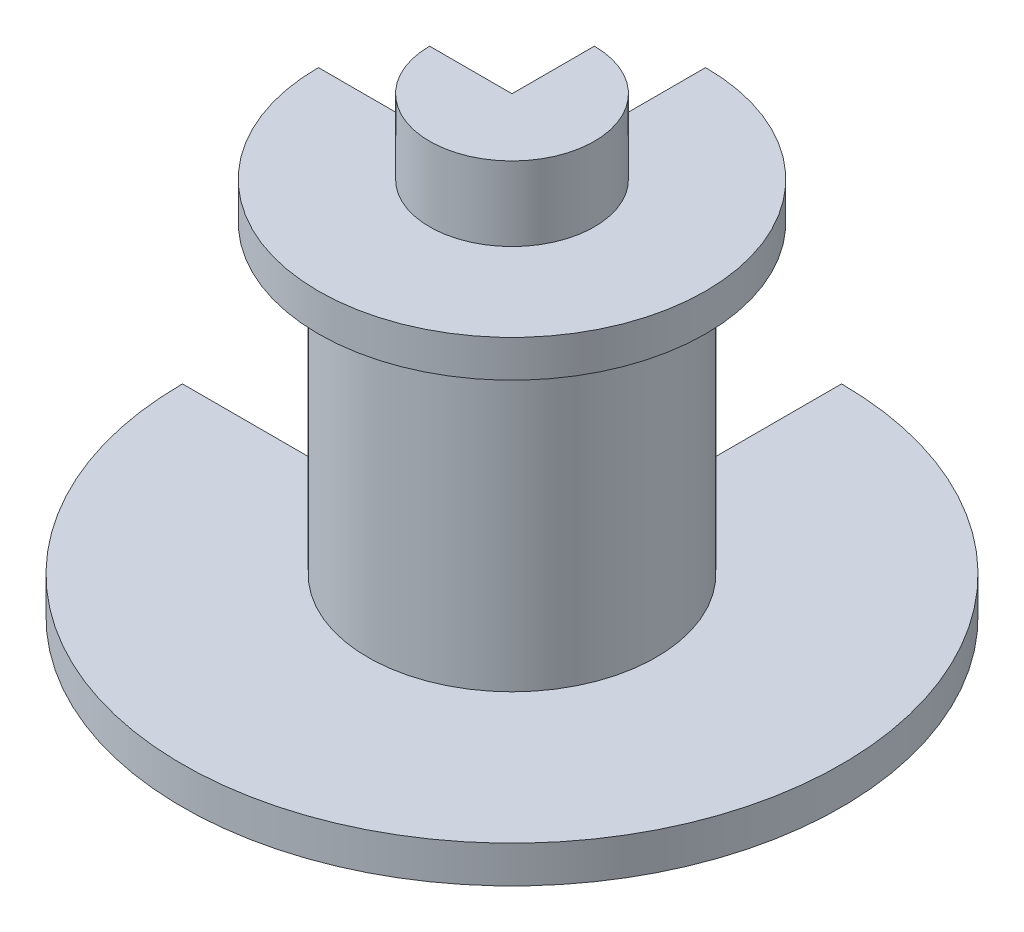
ISO-10303-21;
HEADER;
FILE_DESCRIPTION(('STEP AP214'),'2;1');
FILE_NAME('part.step','',(''),(''),'','','');
FILE_SCHEMA(('AUTOMOTIVE_DESIGN { 1 0 10303 214 1 1 1 1 }'));
ENDSEC;
DATA;
#1=APPLICATION_CONTEXT('core data for automotive mechanical design processes');
#2=APPLICATION_PROTOCOL_DEFINITION('international standard','automotive_design',2000,#1);
#3=PRODUCT_CONTEXT('',#1,'mechanical');
#4=PRODUCT('Part','Part','',(#3));
#5=PRODUCT_RELATED_PRODUCT_CATEGORY('part','',(#4));
#6=PRODUCT_DEFINITION_FORMATION('','',#4);
#7=PRODUCT_DEFINITION_CONTEXT('part definition',#1,'design');
#8=PRODUCT_DEFINITION('design','',#6,#7);
#9=PRODUCT_DEFINITION_SHAPE('','',#8);
#10=(LENGTH_UNIT() NAMED_UNIT(*) SI_UNIT(.MILLI.,.METRE.));
#11=(NAMED_UNIT(*) PLANE_ANGLE_UNIT() SI_UNIT($,.RADIAN.));
#12=(NAMED_UNIT(*) SI_UNIT($,.STERADIAN.) SOLID_ANGLE_UNIT());
#13=UNCERTAINTY_MEASURE_WITH_UNIT(LENGTH_MEASURE(1.E-05),#10,'distance_accuracy_value','');
#14=(GEOMETRIC_REPRESENTATION_CONTEXT(3) GLOBAL_UNCERTAINTY_ASSIGNED_CONTEXT((#13)) GLOBAL_UNIT_ASSIGNED_CONTEXT((#10,
#11,#12)) REPRESENTATION_CONTEXT('',''));
#15=CARTESIAN_POINT('',(0.,0.,0.));
#16=DIRECTION('',(0.,0.,1.));
#17=DIRECTION('',(1.,0.,0.));
#18=AXIS2_PLACEMENT_3D('',#15,#16,#17);
#19=CARTESIAN_POINT('',(0.,0.,0.));
#20=DIRECTION('',(0.,1.,0.));
#21=DIRECTION('',(0.,0.,1.));
#22=AXIS2_PLACEMENT_3D('',#19,#20,#21);
#23=PLANE('',#22);
#24=CARTESIAN_POINT('',(0.,0.,0.));
#25=DIRECTION('',(0.,-1.,0.));
#26=DIRECTION('',(0.,0.,-1.));
#27=AXIS2_PLACEMENT_3D('',#24,#25,#26);
#28=CIRCLE('',#27,80.);
#29=CARTESIAN_POINT('',(-8.37955521322352E-13,0.,-80.));
#30=VERTEX_POINT('',#29);
#31=CARTESIAN_POINT('',(-80.,0.,0.));
#32=VERTEX_POINT('',#31);
#33=EDGE_CURVE('E11',#30,#32,#28,.T.);
#34=ORIENTED_EDGE('',*,*,#33,.T.);
#35=DIRECTION('',(1.,0.,0.));
#36=VECTOR('',#35,1.);
#37=CARTESIAN_POINT('',(0.,0.,0.));
#38=LINE('',#37,#36);
#39=CARTESIAN_POINT('',(0.,0.,0.));
#40=VERTEX_POINT('',#39);
#41=EDGE_CURVE('E54',#32,#40,#38,.T.);
#42=ORIENTED_EDGE('',*,*,#41,.T.);
#43=DIRECTION('',(0.,0.,1.));
#44=VECTOR('',#43,1.);
#45=CARTESIAN_POINT('',(0.,0.,0.));
#46=LINE('',#45,#44);
#47=EDGE_CURVE('E123',#30,#40,#46,.T.);
#48=ORIENTED_EDGE('',*,*,#47,.F.);
#49=EDGE_LOOP('',(#34,#42,#48));
#50=FACE_BOUND('',#49,.T.);
#51=ADVANCED_FACE('F41',(#50),#23,.F.);
#52=CARTESIAN_POINT('',(0.,0.,0.));
#53=DIRECTION('',(0.,-1.,0.));
#54=DIRECTION('',(0.,0.,-1.));
#55=AXIS2_PLACEMENT_3D('',#52,#53,#54);
#56=CYLINDRICAL_SURFACE('',#55,80.);
#57=CARTESIAN_POINT('',(0.,8.99999999999999,0.));
#58=DIRECTION('',(0.,-1.,0.));
#59=DIRECTION('',(0.,0.,-1.));
#60=AXIS2_PLACEMENT_3D('',#57,#58,#59);
#61=CIRCLE('',#60,80.);
#62=CARTESIAN_POINT('',(-8.37955521322352E-13,8.99999999999999,-80.));
#63=VERTEX_POINT('',#62);
#64=CARTESIAN_POINT('',(-80.,8.99999999999999,0.));
#65=VERTEX_POINT('',#64);
#66=EDGE_CURVE('E48',#63,#65,#61,.T.);
#67=ORIENTED_EDGE('',*,*,#66,.T.);
#68=DIRECTION('',(0.,-1.,0.));
#69=VECTOR('',#68,1.);
#70=CARTESIAN_POINT('',(-80.,0.,0.));
#71=LINE('',#70,#69);
#72=EDGE_CURVE('E151',#65,#32,#71,.T.);
#73=ORIENTED_EDGE('',*,*,#72,.T.);
#74=ORIENTED_EDGE('',*,*,#33,.F.);
#75=DIRECTION('',(0.,-1.,0.));
#76=VECTOR('',#75,1.);
#77=CARTESIAN_POINT('',(-8.37955521322352E-13,0.,-80.));
#78=LINE('',#77,#76);
#79=EDGE_CURVE('E173',#63,#30,#78,.T.);
#80=ORIENTED_EDGE('',*,*,#79,.F.);
#81=EDGE_LOOP('',(#67,#73,#74,#80));
#82=FACE_BOUND('',#81,.T.);
#83=ADVANCED_FACE('F184',(#82),#56,.T.);
#84=CARTESIAN_POINT('',(-8.37955521322352E-13,8.99999999999999,-80.));
#85=DIRECTION('',(0.,-1.,0.));
#86=DIRECTION('',(0.,0.,-1.));
#87=AXIS2_PLACEMENT_3D('',#84,#85,#86);
#88=PLANE('',#87);
#89=CARTESIAN_POINT('',(0.,8.99999999999999,0.));
#90=DIRECTION('',(0.,-1.,0.));
#91=DIRECTION('',(0.,0.,-1.));
#92=AXIS2_PLACEMENT_3D('',#89,#90,#91);
#93=CIRCLE('',#92,35.);
#94=CARTESIAN_POINT('',(-3.66605540578529E-13,8.99999999999999,-35.));
#95=VERTEX_POINT('',#94);
#96=CARTESIAN_POINT('',(-35.,8.99999999999999,0.));
#97=VERTEX_POINT('',#96);
#98=EDGE_CURVE('E183',#95,#97,#93,.T.);
#99=ORIENTED_EDGE('',*,*,#98,.T.);
#100=DIRECTION('',(-1.,0.,0.));
#101=VECTOR('',#100,1.);
#102=CARTESIAN_POINT('',(-80.,8.99999999999999,0.));
#103=LINE('',#102,#101);
#104=EDGE_CURVE('E148',#97,#65,#103,.T.);
#105=ORIENTED_EDGE('',*,*,#104,.T.);
#106=ORIENTED_EDGE('',*,*,#66,.F.);
#107=DIRECTION('',(0.,0.,-1.));
#108=VECTOR('',#107,1.);
#109=CARTESIAN_POINT('',(-8.37955521322352E-13,8.99999999999999,-80.));
#110=LINE('',#109,#108);
#111=EDGE_CURVE('E170',#95,#63,#110,.T.);
#112=ORIENTED_EDGE('',*,*,#111,.F.);
#113=EDGE_LOOP('',(#99,#105,#106,#112));
#114=FACE_BOUND('',#113,.T.);
#115=ADVANCED_FACE('F189',(#114),#88,.F.);
#116=CARTESIAN_POINT('',(0.,0.,0.));
#117=DIRECTION('',(0.,-1.,0.));
#118=DIRECTION('',(0.,0.,-1.));
#119=AXIS2_PLACEMENT_3D('',#116,#117,#118);
#120=CYLINDRICAL_SURFACE('',#119,35.);
#121=CARTESIAN_POINT('',(0.,83.,0.));
#122=DIRECTION('',(0.,-1.,0.));
#123=DIRECTION('',(0.,0.,-1.));
#124=AXIS2_PLACEMENT_3D('',#121,#122,#123);
#125=CIRCLE('',#124,35.);
#126=CARTESIAN_POINT('',(-3.66605540578529E-13,83.,-35.));
#127=VERTEX_POINT('',#126);
#128=CARTESIAN_POINT('',(-35.,83.,0.));
#129=VERTEX_POINT('',#128);
#130=EDGE_CURVE('E181',#127,#129,#125,.T.);
#131=ORIENTED_EDGE('',*,*,#130,.T.);
#132=DIRECTION('',(0.,-1.,0.));
#133=VECTOR('',#132,1.);
#134=CARTESIAN_POINT('',(-35.,8.99999999999999,0.));
#135=LINE('',#134,#133);
#136=EDGE_CURVE('E145',#129,#97,#135,.T.);
#137=ORIENTED_EDGE('',*,*,#136,.T.);
#138=ORIENTED_EDGE('',*,*,#98,.F.);
#139=DIRECTION('',(0.,-1.,0.));
#140=VECTOR('',#139,1.);
#141=CARTESIAN_POINT('',(-3.66605540578529E-13,8.99999999999999,-35.));
#142=LINE('',#141,#140);
#143=EDGE_CURVE('E167',#127,#95,#142,.T.);
#144=ORIENTED_EDGE('',*,*,#143,.F.);
#145=EDGE_LOOP('',(#131,#137,#138,#144));
#146=FACE_BOUND('',#145,.T.);
#147=ADVANCED_FACE('F200',(#146),#120,.T.);
#148=CARTESIAN_POINT('',(-3.66605540578529E-13,83.,-35.));
#149=DIRECTION('',(0.,1.,0.));
#150=DIRECTION('',(0.,0.,1.));
#151=AXIS2_PLACEMENT_3D('',#148,#149,#150);
#152=PLANE('',#151);
#153=CARTESIAN_POINT('',(0.,83.,0.));
#154=DIRECTION('',(0.,-1.,0.));
#155=DIRECTION('',(0.,0.,-1.));
#156=AXIS2_PLACEMENT_3D('',#153,#154,#155);
#157=CIRCLE('',#156,47.);
#158=CARTESIAN_POINT('',(-4.92298868776882E-13,83.,-47.));
#159=VERTEX_POINT('',#158);
#160=CARTESIAN_POINT('',(-47.,83.,0.));
#161=VERTEX_POINT('',#160);
#162=EDGE_CURVE('E179',#159,#161,#157,.T.);
#163=ORIENTED_EDGE('',*,*,#162,.T.);
#164=DIRECTION('',(1.,0.,0.));
#165=VECTOR('',#164,1.);
#166=CARTESIAN_POINT('',(-35.,83.,0.));
#167=LINE('',#166,#165);
#168=EDGE_CURVE('E142',#161,#129,#167,.T.);
#169=ORIENTED_EDGE('',*,*,#168,.T.);
#170=ORIENTED_EDGE('',*,*,#130,.F.);
#171=DIRECTION('',(0.,0.,1.));
#172=VECTOR('',#171,1.);
#173=CARTESIAN_POINT('',(-3.66605540578529E-13,83.,-35.));
#174=LINE('',#173,#172);
#175=EDGE_CURVE('E164',#159,#127,#174,.T.);
#176=ORIENTED_EDGE('',*,*,#175,.F.);
#177=EDGE_LOOP('',(#163,#169,#170,#176));
#178=FACE_BOUND('',#177,.T.);
#179=ADVANCED_FACE('F205',(#178),#152,.F.);
#180=CARTESIAN_POINT('',(0.,0.,0.));
#181=DIRECTION('',(0.,-1.,0.));
#182=DIRECTION('',(0.,0.,-1.));
#183=AXIS2_PLACEMENT_3D('',#180,#181,#182);
#184=CYLINDRICAL_SURFACE('',#183,47.);
#185=CARTESIAN_POINT('',(0.,92.,0.));
#186=DIRECTION('',(0.,-1.,0.));
#187=DIRECTION('',(0.,0.,-1.));
#188=AXIS2_PLACEMENT_3D('',#185,#186,#187);
#189=CIRCLE('',#188,47.);
#190=CARTESIAN_POINT('',(-4.92298868776882E-13,92.,-47.));
#191=VERTEX_POINT('',#190);
#192=CARTESIAN_POINT('',(-47.,92.,0.));
#193=VERTEX_POINT('',#192);
#194=EDGE_CURVE('E177',#191,#193,#189,.T.);
#195=ORIENTED_EDGE('',*,*,#194,.T.);
#196=DIRECTION('',(0.,-1.,0.));
#197=VECTOR('',#196,1.);
#198=CARTESIAN_POINT('',(-47.,83.,0.));
#199=LINE('',#198,#197);
#200=EDGE_CURVE('E137',#193,#161,#199,.T.);
#201=ORIENTED_EDGE('',*,*,#200,.T.);
#202=ORIENTED_EDGE('',*,*,#162,.F.);
#203=DIRECTION('',(0.,-1.,0.));
#204=VECTOR('',#203,1.);
#205=CARTESIAN_POINT('',(-4.92298868776882E-13,83.,-47.));
#206=LINE('',#205,#204);
#207=EDGE_CURVE('E161',#191,#159,#206,.T.);
#208=ORIENTED_EDGE('',*,*,#207,.F.);
#209=EDGE_LOOP('',(#195,#201,#202,#208));
#210=FACE_BOUND('',#209,.T.);
#211=ADVANCED_FACE('F209',(#210),#184,.T.);
#212=CARTESIAN_POINT('',(-4.92298868776882E-13,92.,-47.));
#213=DIRECTION('',(0.,-1.,0.));
#214=DIRECTION('',(0.,0.,-1.));
#215=AXIS2_PLACEMENT_3D('',#212,#213,#214);
#216=PLANE('',#215);
#217=CARTESIAN_POINT('',(0.,92.,0.));
#218=DIRECTION('',(0.,-1.,0.));
#219=DIRECTION('',(0.,0.,-1.));
#220=AXIS2_PLACEMENT_3D('',#217,#218,#219);
#221=CIRCLE('',#220,20.);
#222=CARTESIAN_POINT('',(-2.09488880330588E-13,92.,-20.));
#223=VERTEX_POINT('',#222);
#224=CARTESIAN_POINT('',(-20.,92.,0.));
#225=VERTEX_POINT('',#224);
#226=EDGE_CURVE('E122',#223,#225,#221,.T.);
#227=ORIENTED_EDGE('',*,*,#226,.T.);
#228=DIRECTION('',(-1.,0.,0.));
#229=VECTOR('',#228,1.);
#230=CARTESIAN_POINT('',(-47.,92.,0.));
#231=LINE('',#230,#229);
#232=EDGE_CURVE('E135',#225,#193,#231,.T.);
#233=ORIENTED_EDGE('',*,*,#232,.T.);
#234=ORIENTED_EDGE('',*,*,#194,.F.);
#235=DIRECTION('',(0.,0.,-1.));
#236=VECTOR('',#235,1.);
#237=CARTESIAN_POINT('',(-4.92298868776882E-13,92.,-47.));
#238=LINE('',#237,#236);
#239=EDGE_CURVE('E158',#223,#191,#238,.T.);
#240=ORIENTED_EDGE('',*,*,#239,.F.);
#241=EDGE_LOOP('',(#227,#233,#234,#240));
#242=FACE_BOUND('',#241,.T.);
#243=ADVANCED_FACE('F213',(#242),#216,.F.);
#244=CARTESIAN_POINT('',(0.,0.,0.));
#245=DIRECTION('',(0.,-1.,0.));
#246=DIRECTION('',(0.,0.,-1.));
#247=AXIS2_PLACEMENT_3D('',#244,#245,#246);
#248=CYLINDRICAL_SURFACE('',#247,20.);
#249=CARTESIAN_POINT('',(0.,110.,0.));
#250=DIRECTION('',(0.,-1.,0.));
#251=DIRECTION('',(0.,0.,-1.));
#252=AXIS2_PLACEMENT_3D('',#249,#250,#251);
#253=CIRCLE('',#252,20.);
#254=CARTESIAN_POINT('',(-2.09488880330588E-13,110.,-20.));
#255=VERTEX_POINT('',#254);
#256=CARTESIAN_POINT('',(-20.,110.,0.));
#257=VERTEX_POINT('',#256);
#258=EDGE_CURVE('E111',#255,#257,#253,.T.);
#259=ORIENTED_EDGE('',*,*,#258,.T.);
#260=DIRECTION('',(0.,-1.,0.));
#261=VECTOR('',#260,1.);
#262=CARTESIAN_POINT('',(-20.,92.,0.));
#263=LINE('',#262,#261);
#264=EDGE_CURVE('E115',#257,#225,#263,.T.);
#265=ORIENTED_EDGE('',*,*,#264,.T.);
#266=ORIENTED_EDGE('',*,*,#226,.F.);
#267=DIRECTION('',(0.,-1.,0.));
#268=VECTOR('',#267,1.);
#269=CARTESIAN_POINT('',(-2.09488880330588E-13,92.,-20.));
#270=LINE('',#269,#268);
#271=EDGE_CURVE('E118',#255,#223,#270,.T.);
#272=ORIENTED_EDGE('',*,*,#271,.F.);
#273=EDGE_LOOP('',(#259,#265,#266,#272));
#274=FACE_BOUND('',#273,.T.);
#275=ADVANCED_FACE('F113',(#274),#248,.T.);
#276=CARTESIAN_POINT('',(-2.09488880330588E-13,110.,-20.));
#277=DIRECTION('',(0.,-1.,0.));
#278=DIRECTION('',(0.,0.,-1.));
#279=AXIS2_PLACEMENT_3D('',#276,#277,#278);
#280=PLANE('',#279);
#281=DIRECTION('',(0.,0.,-1.));
#282=VECTOR('',#281,1.);
#283=CARTESIAN_POINT('',(-2.09488880330588E-13,110.,-20.));
#284=LINE('',#283,#282);
#285=CARTESIAN_POINT('',(0.,110.,0.));
#286=VERTEX_POINT('',#285);
#287=EDGE_CURVE('E128',#286,#255,#284,.T.);
#288=ORIENTED_EDGE('',*,*,#287,.F.);
#289=DIRECTION('',(-1.,0.,0.));
#290=VECTOR('',#289,1.);
#291=CARTESIAN_POINT('',(-20.,110.,0.));
#292=LINE('',#291,#290);
#293=EDGE_CURVE('E126',#286,#257,#292,.T.);
#294=ORIENTED_EDGE('',*,*,#293,.T.);
#295=ORIENTED_EDGE('',*,*,#258,.F.);
#296=EDGE_LOOP('',(#288,#294,#295));
#297=FACE_BOUND('',#296,.T.);
#298=ADVANCED_FACE('F127',(#297),#280,.F.);
#299=CARTESIAN_POINT('',(0.,0.,0.));
#300=DIRECTION('',(1.,0.,0.));
#301=DIRECTION('',(0.,0.,-1.));
#302=AXIS2_PLACEMENT_3D('',#299,#300,#301);
#303=PLANE('',#302);
#304=DIRECTION('',(0.,1.,0.));
#305=VECTOR('',#304,1.);
#306=CARTESIAN_POINT('',(0.,110.,0.));
#307=LINE('',#306,#305);
#308=EDGE_CURVE('E154',#40,#286,#307,.T.);
#309=ORIENTED_EDGE('',*,*,#308,.T.);
#310=ORIENTED_EDGE('',*,*,#287,.T.);
#311=ORIENTED_EDGE('',*,*,#271,.T.);
#312=ORIENTED_EDGE('',*,*,#239,.T.);
#313=ORIENTED_EDGE('',*,*,#207,.T.);
#314=ORIENTED_EDGE('',*,*,#175,.T.);
#315=ORIENTED_EDGE('',*,*,#143,.T.);
#316=ORIENTED_EDGE('',*,*,#111,.T.);
#317=ORIENTED_EDGE('',*,*,#79,.T.);
#318=ORIENTED_EDGE('',*,*,#47,.T.);
#319=EDGE_LOOP('',(#309,#310,#311,#312,#313,#314,#315,#316,#317,#318));
#320=FACE_BOUND('',#319,.T.);
#321=ADVANCED_FACE('F192',(#320),#303,.F.);
#322=CARTESIAN_POINT('',(0.,0.,0.));
#323=DIRECTION('',(0.,0.,-1.));
#324=DIRECTION('',(-1.,0.,0.));
#325=AXIS2_PLACEMENT_3D('',#322,#323,#324);
#326=PLANE('',#325);
#327=ORIENTED_EDGE('',*,*,#308,.F.);
#328=ORIENTED_EDGE('',*,*,#41,.F.);
#329=ORIENTED_EDGE('',*,*,#72,.F.);
#330=ORIENTED_EDGE('',*,*,#104,.F.);
#331=ORIENTED_EDGE('',*,*,#136,.F.);
#332=ORIENTED_EDGE('',*,*,#168,.F.);
#333=ORIENTED_EDGE('',*,*,#200,.F.);
#334=ORIENTED_EDGE('',*,*,#232,.F.);
#335=ORIENTED_EDGE('',*,*,#264,.F.);
#336=ORIENTED_EDGE('',*,*,#293,.F.);
#337=EDGE_LOOP('',(#327,#328,#329,#330,#331,#332,#333,#334,#335,#336));
#338=FACE_BOUND('',#337,.T.);
#339=ADVANCED_FACE('F132',(#338),#326,.T.);
#340=CLOSED_SHELL('',(#51,#83,#115,#147,#179,#211,#243,#275,#298,#321,#339));
#341=MANIFOLD_SOLID_BREP('B2',#340);
#342=ADVANCED_BREP_SHAPE_REPRESENTATION('',(#18,#341),#14);
#343=SHAPE_DEFINITION_REPRESENTATION(#9,#342);
ENDSEC;
END-ISO-10303-21;
